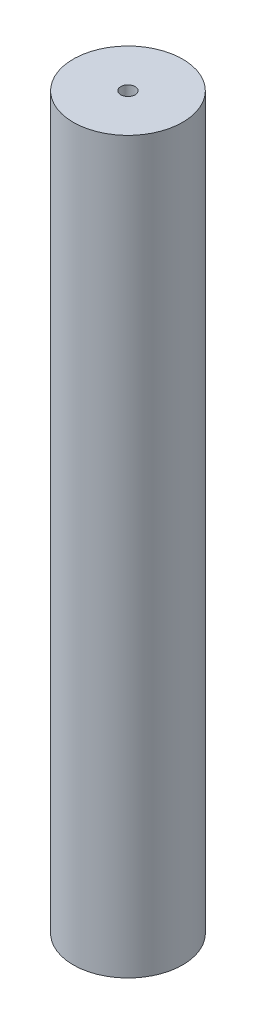
ISO-10303-21;
HEADER;
FILE_DESCRIPTION(('STEP AP214'),'2;1');
FILE_NAME('part.step','',(''),(''),'','','');
FILE_SCHEMA(('AUTOMOTIVE_DESIGN { 1 0 10303 214 1 1 1 1 }'));
ENDSEC;
DATA;
#1=APPLICATION_CONTEXT('core data for automotive mechanical design processes');
#2=APPLICATION_PROTOCOL_DEFINITION('international standard','automotive_design',2000,#1);
#3=PRODUCT_CONTEXT('',#1,'mechanical');
#4=PRODUCT('Part','Part','',(#3));
#5=PRODUCT_RELATED_PRODUCT_CATEGORY('part','',(#4));
#6=PRODUCT_DEFINITION_FORMATION('','',#4);
#7=PRODUCT_DEFINITION_CONTEXT('part definition',#1,'design');
#8=PRODUCT_DEFINITION('design','',#6,#7);
#9=PRODUCT_DEFINITION_SHAPE('','',#8);
#10=(LENGTH_UNIT() NAMED_UNIT(*) SI_UNIT(.MILLI.,.METRE.));
#11=(NAMED_UNIT(*) PLANE_ANGLE_UNIT() SI_UNIT($,.RADIAN.));
#12=(NAMED_UNIT(*) SI_UNIT($,.STERADIAN.) SOLID_ANGLE_UNIT());
#13=UNCERTAINTY_MEASURE_WITH_UNIT(LENGTH_MEASURE(1.E-05),#10,'distance_accuracy_value','');
#14=(GEOMETRIC_REPRESENTATION_CONTEXT(3) GLOBAL_UNCERTAINTY_ASSIGNED_CONTEXT((#13)) GLOBAL_UNIT_ASSIGNED_CONTEXT((#10,
#11,#12)) REPRESENTATION_CONTEXT('',''));
#15=CARTESIAN_POINT('',(0.,0.,0.));
#16=DIRECTION('',(0.,0.,1.));
#17=DIRECTION('',(1.,0.,0.));
#18=AXIS2_PLACEMENT_3D('',#15,#16,#17);
#19=CARTESIAN_POINT('',(0.,127.,0.));
#20=DIRECTION('',(0.,-1.,0.));
#21=DIRECTION('',(0.,0.,-1.));
#22=AXIS2_PLACEMENT_3D('',#19,#20,#21);
#23=CYLINDRICAL_SURFACE('',#22,19.05);
#24=CARTESIAN_POINT('',(0.,127.,0.));
#25=DIRECTION('',(0.,1.,0.));
#26=DIRECTION('',(0.,0.,1.));
#27=AXIS2_PLACEMENT_3D('',#24,#25,#26);
#28=CIRCLE('',#27,19.05);
#29=CARTESIAN_POINT('',(0.,127.,19.05));
#30=VERTEX_POINT('',#29);
#31=EDGE_CURVE('E11',#30,#30,#28,.T.);
#32=ORIENTED_EDGE('',*,*,#31,.F.);
#33=EDGE_LOOP('',(#32));
#34=FACE_BOUND('',#33,.T.);
#35=CARTESIAN_POINT('',(0.,-127.,0.));
#36=DIRECTION('',(0.,1.,0.));
#37=DIRECTION('',(0.,0.,1.));
#38=AXIS2_PLACEMENT_3D('',#35,#36,#37);
#39=CIRCLE('',#38,19.05);
#40=CARTESIAN_POINT('',(0.,-127.,19.05));
#41=VERTEX_POINT('',#40);
#42=EDGE_CURVE('E45',#41,#41,#39,.T.);
#43=ORIENTED_EDGE('',*,*,#42,.T.);
#44=EDGE_LOOP('',(#43));
#45=FACE_BOUND('',#44,.T.);
#46=ADVANCED_FACE('F42',(#34,#45),#23,.T.);
#47=CARTESIAN_POINT('',(0.,127.,0.));
#48=DIRECTION('',(0.,1.,0.));
#49=DIRECTION('',(0.,0.,1.));
#50=AXIS2_PLACEMENT_3D('',#47,#48,#49);
#51=PLANE('',#50);
#52=CARTESIAN_POINT('',(0.,127.,0.));
#53=DIRECTION('',(0.,1.,0.));
#54=DIRECTION('',(0.,0.,1.));
#55=AXIS2_PLACEMENT_3D('',#52,#53,#54);
#56=CIRCLE('',#55,2.5);
#57=CARTESIAN_POINT('',(0.,127.,2.5));
#58=VERTEX_POINT('',#57);
#59=EDGE_CURVE('E63',#58,#58,#56,.T.);
#60=ORIENTED_EDGE('',*,*,#59,.F.);
#61=EDGE_LOOP('',(#60));
#62=FACE_BOUND('',#61,.T.);
#63=ORIENTED_EDGE('',*,*,#31,.T.);
#64=EDGE_LOOP('',(#63));
#65=FACE_BOUND('',#64,.T.);
#66=ADVANCED_FACE('F73',(#62,#65),#51,.T.);
#67=CARTESIAN_POINT('',(0.,-127.,0.));
#68=DIRECTION('',(0.,1.,0.));
#69=DIRECTION('',(0.,0.,1.));
#70=AXIS2_PLACEMENT_3D('',#67,#68,#69);
#71=PLANE('',#70);
#72=ORIENTED_EDGE('',*,*,#42,.F.);
#73=EDGE_LOOP('',(#72));
#74=FACE_BOUND('',#73,.T.);
#75=ADVANCED_FACE('F56',(#74),#71,.F.);
#76=CARTESIAN_POINT('',(0.,112.,0.));
#77=DIRECTION('',(0.,1.,0.));
#78=DIRECTION('',(0.,0.,1.));
#79=AXIS2_PLACEMENT_3D('',#76,#77,#78);
#80=CONICAL_SURFACE('',#79,2.5,1.02974425867665);
#81=CARTESIAN_POINT('',(0.,110.497848452431,0.));
#82=VERTEX_POINT('',#81);
#83=VERTEX_LOOP('',#82);
#84=FACE_BOUND('',#83,.T.);
#85=CARTESIAN_POINT('',(0.,112.,0.));
#86=DIRECTION('',(0.,1.,0.));
#87=DIRECTION('',(0.,0.,1.));
#88=AXIS2_PLACEMENT_3D('',#85,#86,#87);
#89=CIRCLE('',#88,2.5);
#90=CARTESIAN_POINT('',(0.,112.,2.5));
#91=VERTEX_POINT('',#90);
#92=EDGE_CURVE('E60',#91,#91,#89,.T.);
#93=ORIENTED_EDGE('',*,*,#92,.T.);
#94=EDGE_LOOP('',(#93));
#95=FACE_BOUND('',#94,.T.);
#96=ADVANCED_FACE('F52',(#84,#95),#80,.F.);
#97=CARTESIAN_POINT('',(0.,127.,0.));
#98=DIRECTION('',(0.,1.,0.));
#99=DIRECTION('',(0.,0.,1.));
#100=AXIS2_PLACEMENT_3D('',#97,#98,#99);
#101=CYLINDRICAL_SURFACE('',#100,2.5);
#102=ORIENTED_EDGE('',*,*,#92,.F.);
#103=EDGE_LOOP('',(#102));
#104=FACE_BOUND('',#103,.T.);
#105=ORIENTED_EDGE('',*,*,#59,.T.);
#106=EDGE_LOOP('',(#105));
#107=FACE_BOUND('',#106,.T.);
#108=ADVANCED_FACE('F55',(#104,#107),#101,.F.);
#109=CLOSED_SHELL('',(#46,#66,#75,#96,#108));
#110=MANIFOLD_SOLID_BREP('B2',#109);
#111=ADVANCED_BREP_SHAPE_REPRESENTATION('',(#18,#110),#14);
#112=SHAPE_DEFINITION_REPRESENTATION(#9,#111);
ENDSEC;
END-ISO-10303-21;
